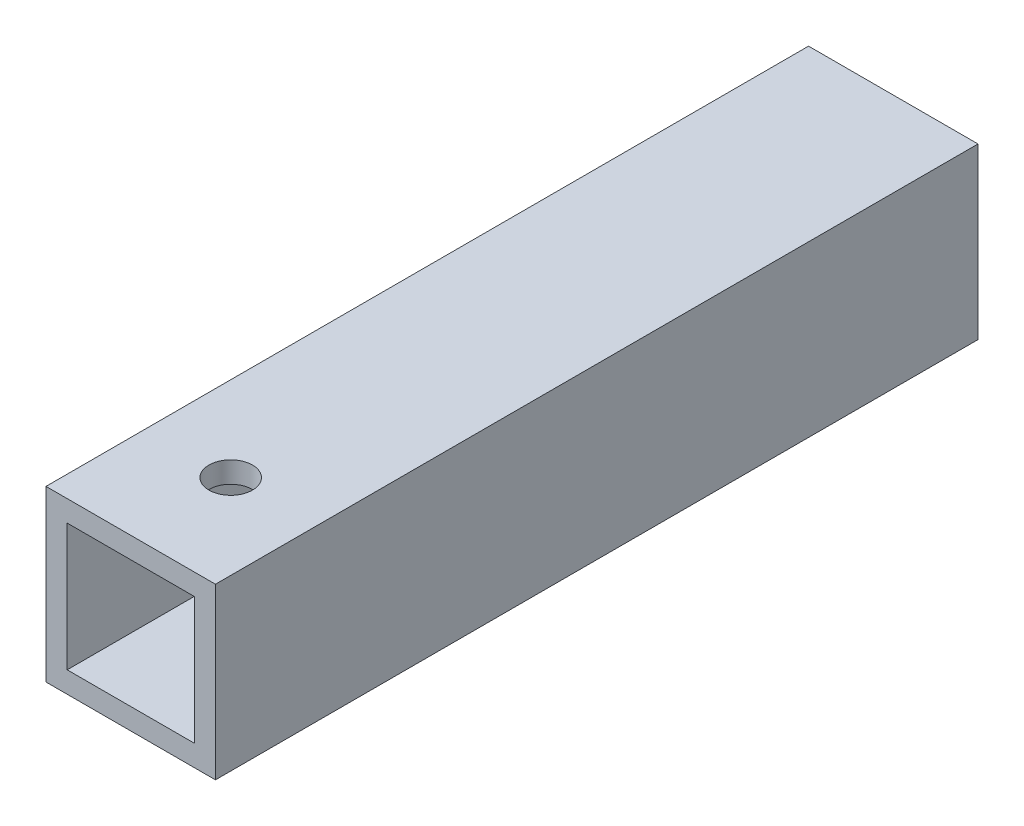
ISO-10303-21;
HEADER;
FILE_DESCRIPTION(('STEP AP214'),'2;1');
FILE_NAME('part.step','',(''),(''),'','','');
FILE_SCHEMA(('AUTOMOTIVE_DESIGN { 1 0 10303 214 1 1 1 1 }'));
ENDSEC;
DATA;
#1=APPLICATION_CONTEXT('core data for automotive mechanical design processes');
#2=APPLICATION_PROTOCOL_DEFINITION('international standard','automotive_design',2000,#1);
#3=PRODUCT_CONTEXT('',#1,'mechanical');
#4=PRODUCT('Part','Part','',(#3));
#5=PRODUCT_RELATED_PRODUCT_CATEGORY('part','',(#4));
#6=PRODUCT_DEFINITION_FORMATION('','',#4);
#7=PRODUCT_DEFINITION_CONTEXT('part definition',#1,'design');
#8=PRODUCT_DEFINITION('design','',#6,#7);
#9=PRODUCT_DEFINITION_SHAPE('','',#8);
#10=(LENGTH_UNIT() NAMED_UNIT(*) SI_UNIT(.MILLI.,.METRE.));
#11=(NAMED_UNIT(*) PLANE_ANGLE_UNIT() SI_UNIT($,.RADIAN.));
#12=(NAMED_UNIT(*) SI_UNIT($,.STERADIAN.) SOLID_ANGLE_UNIT());
#13=UNCERTAINTY_MEASURE_WITH_UNIT(LENGTH_MEASURE(1.E-05),#10,'distance_accuracy_value','');
#14=(GEOMETRIC_REPRESENTATION_CONTEXT(3) GLOBAL_UNCERTAINTY_ASSIGNED_CONTEXT((#13)) GLOBAL_UNIT_ASSIGNED_CONTEXT((#10,
#11,#12)) REPRESENTATION_CONTEXT('',''));
#15=CARTESIAN_POINT('',(0.,0.,0.));
#16=DIRECTION('',(0.,0.,1.));
#17=DIRECTION('',(1.,0.,0.));
#18=AXIS2_PLACEMENT_3D('',#15,#16,#17);
#19=CARTESIAN_POINT('',(0.,0.,114.3));
#20=DIRECTION('',(0.,0.,1.));
#21=DIRECTION('',(1.,0.,0.));
#22=AXIS2_PLACEMENT_3D('',#19,#20,#21);
#23=PLANE('',#22);
#24=DIRECTION('',(0.,-1.,0.));
#25=VECTOR('',#24,1.);
#26=CARTESIAN_POINT('',(-12.6999999999999,-12.7,114.3));
#27=LINE('',#26,#25);
#28=CARTESIAN_POINT('',(-12.6999999999999,12.6999999999999,114.3));
#29=VERTEX_POINT('',#28);
#30=CARTESIAN_POINT('',(-12.6999999999999,-12.7,114.3));
#31=VERTEX_POINT('',#30);
#32=EDGE_CURVE('E140',#29,#31,#27,.T.);
#33=ORIENTED_EDGE('',*,*,#32,.T.);
#34=DIRECTION('',(1.,0.,0.));
#35=VECTOR('',#34,1.);
#36=CARTESIAN_POINT('',(12.7,-12.7,114.3));
#37=LINE('',#36,#35);
#38=CARTESIAN_POINT('',(12.7,-12.7,114.3));
#39=VERTEX_POINT('',#38);
#40=EDGE_CURVE('E143',#31,#39,#37,.T.);
#41=ORIENTED_EDGE('',*,*,#40,.T.);
#42=DIRECTION('',(0.,1.,0.));
#43=VECTOR('',#42,1.);
#44=CARTESIAN_POINT('',(12.7,-12.7,114.3));
#45=LINE('',#44,#43);
#46=CARTESIAN_POINT('',(12.7,12.7,114.3));
#47=VERTEX_POINT('',#46);
#48=EDGE_CURVE('E146',#39,#47,#45,.T.);
#49=ORIENTED_EDGE('',*,*,#48,.T.);
#50=DIRECTION('',(-1.,0.,0.));
#51=VECTOR('',#50,1.);
#52=CARTESIAN_POINT('',(12.7,12.7,114.3));
#53=LINE('',#52,#51);
#54=EDGE_CURVE('E148',#47,#29,#53,.T.);
#55=ORIENTED_EDGE('',*,*,#54,.T.);
#56=EDGE_LOOP('',(#33,#41,#49,#55));
#57=FACE_BOUND('',#56,.T.);
#58=DIRECTION('',(1.,0.,0.));
#59=VECTOR('',#58,1.);
#60=CARTESIAN_POINT('',(9.52500000000012,-9.52499999999988,114.3));
#61=LINE('',#60,#59);
#62=CARTESIAN_POINT('',(-9.5249999999999,-9.52499999999988,114.3));
#63=VERTEX_POINT('',#62);
#64=CARTESIAN_POINT('',(9.52500000000012,-9.52499999999988,114.3));
#65=VERTEX_POINT('',#64);
#66=EDGE_CURVE('E110',#63,#65,#61,.T.);
#67=ORIENTED_EDGE('',*,*,#66,.F.);
#68=DIRECTION('',(0.,-1.,0.));
#69=VECTOR('',#68,1.);
#70=CARTESIAN_POINT('',(-9.5249999999999,-9.52499999999988,114.3));
#71=LINE('',#70,#69);
#72=CARTESIAN_POINT('',(-9.5249999999999,9.52499999999997,114.3));
#73=VERTEX_POINT('',#72);
#74=EDGE_CURVE('E102',#73,#63,#71,.T.);
#75=ORIENTED_EDGE('',*,*,#74,.F.);
#76=DIRECTION('',(-1.,0.,0.));
#77=VECTOR('',#76,1.);
#78=CARTESIAN_POINT('',(9.52500000000023,9.52499999999996,114.3));
#79=LINE('',#78,#77);
#80=CARTESIAN_POINT('',(9.52500000000023,9.52499999999996,114.3));
#81=VERTEX_POINT('',#80);
#82=EDGE_CURVE('E124',#81,#73,#79,.T.);
#83=ORIENTED_EDGE('',*,*,#82,.F.);
#84=DIRECTION('',(0.,1.,0.));
#85=VECTOR('',#84,1.);
#86=CARTESIAN_POINT('',(9.52500000000012,-9.52499999999988,114.3));
#87=LINE('',#86,#85);
#88=EDGE_CURVE('E122',#65,#81,#87,.T.);
#89=ORIENTED_EDGE('',*,*,#88,.F.);
#90=EDGE_LOOP('',(#67,#75,#83,#89));
#91=FACE_BOUND('',#90,.T.);
#92=ADVANCED_FACE('F36',(#57,#91),#23,.T.);
#93=CARTESIAN_POINT('',(0.,0.,0.));
#94=DIRECTION('',(0.,0.,1.));
#95=DIRECTION('',(1.,0.,0.));
#96=AXIS2_PLACEMENT_3D('',#93,#94,#95);
#97=PLANE('',#96);
#98=DIRECTION('',(0.,-1.,0.));
#99=VECTOR('',#98,1.);
#100=CARTESIAN_POINT('',(-12.7,-12.7,0.));
#101=LINE('',#100,#99);
#102=CARTESIAN_POINT('',(-12.6999999999999,12.7,0.));
#103=VERTEX_POINT('',#102);
#104=CARTESIAN_POINT('',(-12.7,-12.7,0.));
#105=VERTEX_POINT('',#104);
#106=EDGE_CURVE('E118',#103,#105,#101,.T.);
#107=ORIENTED_EDGE('',*,*,#106,.F.);
#108=DIRECTION('',(-1.,0.,0.));
#109=VECTOR('',#108,1.);
#110=CARTESIAN_POINT('',(12.7,12.6999999999999,0.));
#111=LINE('',#110,#109);
#112=CARTESIAN_POINT('',(12.7,12.6999999999999,0.));
#113=VERTEX_POINT('',#112);
#114=EDGE_CURVE('E144',#113,#103,#111,.T.);
#115=ORIENTED_EDGE('',*,*,#114,.F.);
#116=DIRECTION('',(0.,1.,0.));
#117=VECTOR('',#116,1.);
#118=CARTESIAN_POINT('',(12.6999999999999,-12.7000000000001,0.));
#119=LINE('',#118,#117);
#120=CARTESIAN_POINT('',(12.6999999999999,-12.7000000000001,0.));
#121=VERTEX_POINT('',#120);
#122=EDGE_CURVE('E155',#121,#113,#119,.T.);
#123=ORIENTED_EDGE('',*,*,#122,.F.);
#124=DIRECTION('',(1.,0.,0.));
#125=VECTOR('',#124,1.);
#126=CARTESIAN_POINT('',(12.6999999999999,-12.7000000000001,0.));
#127=LINE('',#126,#125);
#128=EDGE_CURVE('E153',#105,#121,#127,.T.);
#129=ORIENTED_EDGE('',*,*,#128,.F.);
#130=EDGE_LOOP('',(#107,#115,#123,#129));
#131=FACE_BOUND('',#130,.T.);
#132=DIRECTION('',(0.,-1.,0.));
#133=VECTOR('',#132,1.);
#134=CARTESIAN_POINT('',(-9.5249999999999,-9.52499999999993,0.));
#135=LINE('',#134,#133);
#136=CARTESIAN_POINT('',(-9.5249999999999,9.52499999999997,0.));
#137=VERTEX_POINT('',#136);
#138=CARTESIAN_POINT('',(-9.5249999999999,-9.52499999999993,0.));
#139=VERTEX_POINT('',#138);
#140=EDGE_CURVE('E60',#137,#139,#135,.T.);
#141=ORIENTED_EDGE('',*,*,#140,.T.);
#142=DIRECTION('',(1.,0.,0.));
#143=VECTOR('',#142,1.);
#144=CARTESIAN_POINT('',(9.52500000000001,-9.525,0.));
#145=LINE('',#144,#143);
#146=CARTESIAN_POINT('',(9.52500000000001,-9.525,0.));
#147=VERTEX_POINT('',#146);
#148=EDGE_CURVE('E117',#139,#147,#145,.T.);
#149=ORIENTED_EDGE('',*,*,#148,.T.);
#150=DIRECTION('',(0.,1.,0.));
#151=VECTOR('',#150,1.);
#152=CARTESIAN_POINT('',(9.52500000000001,-9.525,0.));
#153=LINE('',#152,#151);
#154=CARTESIAN_POINT('',(9.52500000000012,9.52499999999993,0.));
#155=VERTEX_POINT('',#154);
#156=EDGE_CURVE('E132',#147,#155,#153,.T.);
#157=ORIENTED_EDGE('',*,*,#156,.T.);
#158=DIRECTION('',(-1.,0.,0.));
#159=VECTOR('',#158,1.);
#160=CARTESIAN_POINT('',(9.52500000000012,9.52499999999993,0.));
#161=LINE('',#160,#159);
#162=EDGE_CURVE('E111',#155,#137,#161,.T.);
#163=ORIENTED_EDGE('',*,*,#162,.T.);
#164=EDGE_LOOP('',(#141,#149,#157,#163));
#165=FACE_BOUND('',#164,.T.);
#166=ADVANCED_FACE('F174',(#131,#165),#97,.F.);
#167=CARTESIAN_POINT('',(-12.6999999999999,-12.7,114.3));
#168=DIRECTION('',(1.,0.,0.));
#169=DIRECTION('',(0.,0.,-1.));
#170=AXIS2_PLACEMENT_3D('',#167,#168,#169);
#171=PLANE('',#170);
#172=ORIENTED_EDGE('',*,*,#106,.T.);
#173=DIRECTION('',(0.,0.,-1.));
#174=VECTOR('',#173,1.);
#175=CARTESIAN_POINT('',(-12.6999999999999,-12.7,114.3));
#176=LINE('',#175,#174);
#177=EDGE_CURVE('E11',#31,#105,#176,.T.);
#178=ORIENTED_EDGE('',*,*,#177,.F.);
#179=ORIENTED_EDGE('',*,*,#32,.F.);
#180=DIRECTION('',(0.,0.,-1.));
#181=VECTOR('',#180,1.);
#182=CARTESIAN_POINT('',(-12.6999999999999,12.6999999999999,114.3));
#183=LINE('',#182,#181);
#184=EDGE_CURVE('E150',#29,#103,#183,.T.);
#185=ORIENTED_EDGE('',*,*,#184,.T.);
#186=EDGE_LOOP('',(#172,#178,#179,#185));
#187=FACE_BOUND('',#186,.T.);
#188=ADVANCED_FACE('F38',(#187),#171,.F.);
#189=CARTESIAN_POINT('',(12.7,-12.7,114.3));
#190=DIRECTION('',(0.,1.,0.));
#191=DIRECTION('',(-1.,0.,0.));
#192=AXIS2_PLACEMENT_3D('',#189,#190,#191);
#193=PLANE('',#192);
#194=CARTESIAN_POINT('',(0.,-12.7000000000001,99.314));
#195=DIRECTION('',(0.,1.,0.));
#196=DIRECTION('',(-1.,0.,0.));
#197=AXIS2_PLACEMENT_3D('',#194,#195,#196);
#198=CIRCLE('',#197,3.26389999999999);
#199=CARTESIAN_POINT('',(-3.26389999999999,-12.7000000000001,99.314));
#200=VERTEX_POINT('',#199);
#201=EDGE_CURVE('E211',#200,#200,#198,.T.);
#202=ORIENTED_EDGE('',*,*,#201,.T.);
#203=EDGE_LOOP('',(#202));
#204=FACE_BOUND('',#203,.T.);
#205=ORIENTED_EDGE('',*,*,#128,.T.);
#206=DIRECTION('',(0.,0.,-1.));
#207=VECTOR('',#206,1.);
#208=CARTESIAN_POINT('',(12.7,-12.7,114.3));
#209=LINE('',#208,#207);
#210=EDGE_CURVE('E45',#39,#121,#209,.T.);
#211=ORIENTED_EDGE('',*,*,#210,.F.);
#212=ORIENTED_EDGE('',*,*,#40,.F.);
#213=ORIENTED_EDGE('',*,*,#177,.T.);
#214=EDGE_LOOP('',(#205,#211,#212,#213));
#215=FACE_BOUND('',#214,.T.);
#216=ADVANCED_FACE('F184',(#204,#215),#193,.F.);
#217=CARTESIAN_POINT('',(12.7,-12.7,114.3));
#218=DIRECTION('',(-1.,0.,0.));
#219=DIRECTION('',(0.,0.,1.));
#220=AXIS2_PLACEMENT_3D('',#217,#218,#219);
#221=PLANE('',#220);
#222=ORIENTED_EDGE('',*,*,#122,.T.);
#223=DIRECTION('',(0.,0.,-1.));
#224=VECTOR('',#223,1.);
#225=CARTESIAN_POINT('',(12.7,12.7,114.3));
#226=LINE('',#225,#224);
#227=EDGE_CURVE('E160',#47,#113,#226,.T.);
#228=ORIENTED_EDGE('',*,*,#227,.F.);
#229=ORIENTED_EDGE('',*,*,#48,.F.);
#230=ORIENTED_EDGE('',*,*,#210,.T.);
#231=EDGE_LOOP('',(#222,#228,#229,#230));
#232=FACE_BOUND('',#231,.T.);
#233=ADVANCED_FACE('F168',(#232),#221,.F.);
#234=CARTESIAN_POINT('',(12.7,12.7,114.3));
#235=DIRECTION('',(0.,-1.,0.));
#236=DIRECTION('',(1.,0.,0.));
#237=AXIS2_PLACEMENT_3D('',#234,#235,#236);
#238=PLANE('',#237);
#239=CARTESIAN_POINT('',(2.22044604925031E-13,12.7,99.314));
#240=DIRECTION('',(0.,1.,0.));
#241=DIRECTION('',(-1.,0.,0.));
#242=AXIS2_PLACEMENT_3D('',#239,#240,#241);
#243=CIRCLE('',#242,3.26389999999999);
#244=CARTESIAN_POINT('',(-3.26389999999977,12.7,99.314));
#245=VERTEX_POINT('',#244);
#246=EDGE_CURVE('E209',#245,#245,#243,.T.);
#247=ORIENTED_EDGE('',*,*,#246,.F.);
#248=EDGE_LOOP('',(#247));
#249=FACE_BOUND('',#248,.T.);
#250=ORIENTED_EDGE('',*,*,#114,.T.);
#251=ORIENTED_EDGE('',*,*,#184,.F.);
#252=ORIENTED_EDGE('',*,*,#54,.F.);
#253=ORIENTED_EDGE('',*,*,#227,.T.);
#254=EDGE_LOOP('',(#250,#251,#252,#253));
#255=FACE_BOUND('',#254,.T.);
#256=ADVANCED_FACE('F178',(#249,#255),#238,.F.);
#257=CARTESIAN_POINT('',(-9.5249999999999,-9.52499999999988,114.3));
#258=DIRECTION('',(1.,0.,0.));
#259=DIRECTION('',(0.,0.,-1.));
#260=AXIS2_PLACEMENT_3D('',#257,#258,#259);
#261=PLANE('',#260);
#262=ORIENTED_EDGE('',*,*,#140,.F.);
#263=DIRECTION('',(0.,0.,-1.));
#264=VECTOR('',#263,1.);
#265=CARTESIAN_POINT('',(-9.5249999999999,9.52499999999997,114.3));
#266=LINE('',#265,#264);
#267=EDGE_CURVE('E106',#73,#137,#266,.T.);
#268=ORIENTED_EDGE('',*,*,#267,.F.);
#269=ORIENTED_EDGE('',*,*,#74,.T.);
#270=DIRECTION('',(0.,0.,-1.));
#271=VECTOR('',#270,1.);
#272=CARTESIAN_POINT('',(-9.5249999999999,-9.52499999999988,114.3));
#273=LINE('',#272,#271);
#274=EDGE_CURVE('E105',#63,#139,#273,.T.);
#275=ORIENTED_EDGE('',*,*,#274,.T.);
#276=EDGE_LOOP('',(#262,#268,#269,#275));
#277=FACE_BOUND('',#276,.T.);
#278=ADVANCED_FACE('F104',(#277),#261,.T.);
#279=CARTESIAN_POINT('',(9.52500000000012,-9.52499999999988,114.3));
#280=DIRECTION('',(0.,1.,0.));
#281=DIRECTION('',(0.,0.,1.));
#282=AXIS2_PLACEMENT_3D('',#279,#280,#281);
#283=PLANE('',#282);
#284=CARTESIAN_POINT('',(1.11022302462516E-13,-9.52499999999995,99.3139999999999));
#285=DIRECTION('',(0.,1.,0.));
#286=DIRECTION('',(0.,0.,1.));
#287=AXIS2_PLACEMENT_3D('',#284,#285,#286);
#288=CIRCLE('',#287,3.26389999999999);
#289=CARTESIAN_POINT('',(1.10928220748182E-13,-9.52499999999995,102.5779));
#290=VERTEX_POINT('',#289);
#291=EDGE_CURVE('E130',#290,#290,#288,.T.);
#292=ORIENTED_EDGE('',*,*,#291,.F.);
#293=EDGE_LOOP('',(#292));
#294=FACE_BOUND('',#293,.T.);
#295=ORIENTED_EDGE('',*,*,#148,.F.);
#296=ORIENTED_EDGE('',*,*,#274,.F.);
#297=ORIENTED_EDGE('',*,*,#66,.T.);
#298=DIRECTION('',(0.,0.,-1.));
#299=VECTOR('',#298,1.);
#300=CARTESIAN_POINT('',(9.52500000000012,-9.52499999999988,114.3));
#301=LINE('',#300,#299);
#302=EDGE_CURVE('E119',#65,#147,#301,.T.);
#303=ORIENTED_EDGE('',*,*,#302,.T.);
#304=EDGE_LOOP('',(#295,#296,#297,#303));
#305=FACE_BOUND('',#304,.T.);
#306=ADVANCED_FACE('F114',(#294,#305),#283,.T.);
#307=CARTESIAN_POINT('',(9.52500000000012,-9.52499999999988,114.3));
#308=DIRECTION('',(-1.,0.,0.));
#309=DIRECTION('',(0.,0.,1.));
#310=AXIS2_PLACEMENT_3D('',#307,#308,#309);
#311=PLANE('',#310);
#312=ORIENTED_EDGE('',*,*,#156,.F.);
#313=ORIENTED_EDGE('',*,*,#302,.F.);
#314=ORIENTED_EDGE('',*,*,#88,.T.);
#315=DIRECTION('',(0.,0.,-1.));
#316=VECTOR('',#315,1.);
#317=CARTESIAN_POINT('',(9.52500000000023,9.52499999999996,114.3));
#318=LINE('',#317,#316);
#319=EDGE_CURVE('E52',#81,#155,#318,.T.);
#320=ORIENTED_EDGE('',*,*,#319,.T.);
#321=EDGE_LOOP('',(#312,#313,#314,#320));
#322=FACE_BOUND('',#321,.T.);
#323=ADVANCED_FACE('F224',(#322),#311,.T.);
#324=CARTESIAN_POINT('',(9.52500000000023,9.52499999999996,114.3));
#325=DIRECTION('',(0.,-1.,0.));
#326=DIRECTION('',(0.,0.,-1.));
#327=AXIS2_PLACEMENT_3D('',#324,#325,#326);
#328=PLANE('',#327);
#329=CARTESIAN_POINT('',(2.22044604925031E-13,9.52499999999995,99.314));
#330=DIRECTION('',(0.,-1.,0.));
#331=DIRECTION('',(0.,0.,-1.));
#332=AXIS2_PLACEMENT_3D('',#329,#330,#331);
#333=CIRCLE('',#332,3.26389999999999);
#334=CARTESIAN_POINT('',(2.22138686639365E-13,9.52499999999995,96.0501));
#335=VERTEX_POINT('',#334);
#336=EDGE_CURVE('E40',#335,#335,#333,.T.);
#337=ORIENTED_EDGE('',*,*,#336,.F.);
#338=EDGE_LOOP('',(#337));
#339=FACE_BOUND('',#338,.T.);
#340=ORIENTED_EDGE('',*,*,#162,.F.);
#341=ORIENTED_EDGE('',*,*,#319,.F.);
#342=ORIENTED_EDGE('',*,*,#82,.T.);
#343=ORIENTED_EDGE('',*,*,#267,.T.);
#344=EDGE_LOOP('',(#340,#341,#342,#343));
#345=FACE_BOUND('',#344,.T.);
#346=ADVANCED_FACE('F222',(#339,#345),#328,.T.);
#347=CARTESIAN_POINT('',(0.,-12.7000000000001,99.314));
#348=DIRECTION('',(0.,1.,0.));
#349=DIRECTION('',(-1.,0.,0.));
#350=AXIS2_PLACEMENT_3D('',#347,#348,#349);
#351=CYLINDRICAL_SURFACE('',#350,3.26389999999999);
#352=ORIENTED_EDGE('',*,*,#336,.T.);
#353=EDGE_LOOP('',(#352));
#354=FACE_BOUND('',#353,.T.);
#355=ORIENTED_EDGE('',*,*,#246,.T.);
#356=EDGE_LOOP('',(#355));
#357=FACE_BOUND('',#356,.T.);
#358=ADVANCED_FACE('F220',(#354,#357),#351,.F.);
#359=ORIENTED_EDGE('',*,*,#291,.T.);
#360=EDGE_LOOP('',(#359));
#361=FACE_BOUND('',#360,.T.);
#362=ORIENTED_EDGE('',*,*,#201,.F.);
#363=EDGE_LOOP('',(#362));
#364=FACE_BOUND('',#363,.T.);
#365=ADVANCED_FACE('F236',(#361,#364),#351,.F.);
#366=CLOSED_SHELL('',(#92,#166,#188,#216,#233,#256,#278,#306,#323,#346,#358,#365));
#367=MANIFOLD_SOLID_BREP('B2',#366);
#368=ADVANCED_BREP_SHAPE_REPRESENTATION('',(#18,#367),#14);
#369=SHAPE_DEFINITION_REPRESENTATION(#9,#368);
ENDSEC;
END-ISO-10303-21;
